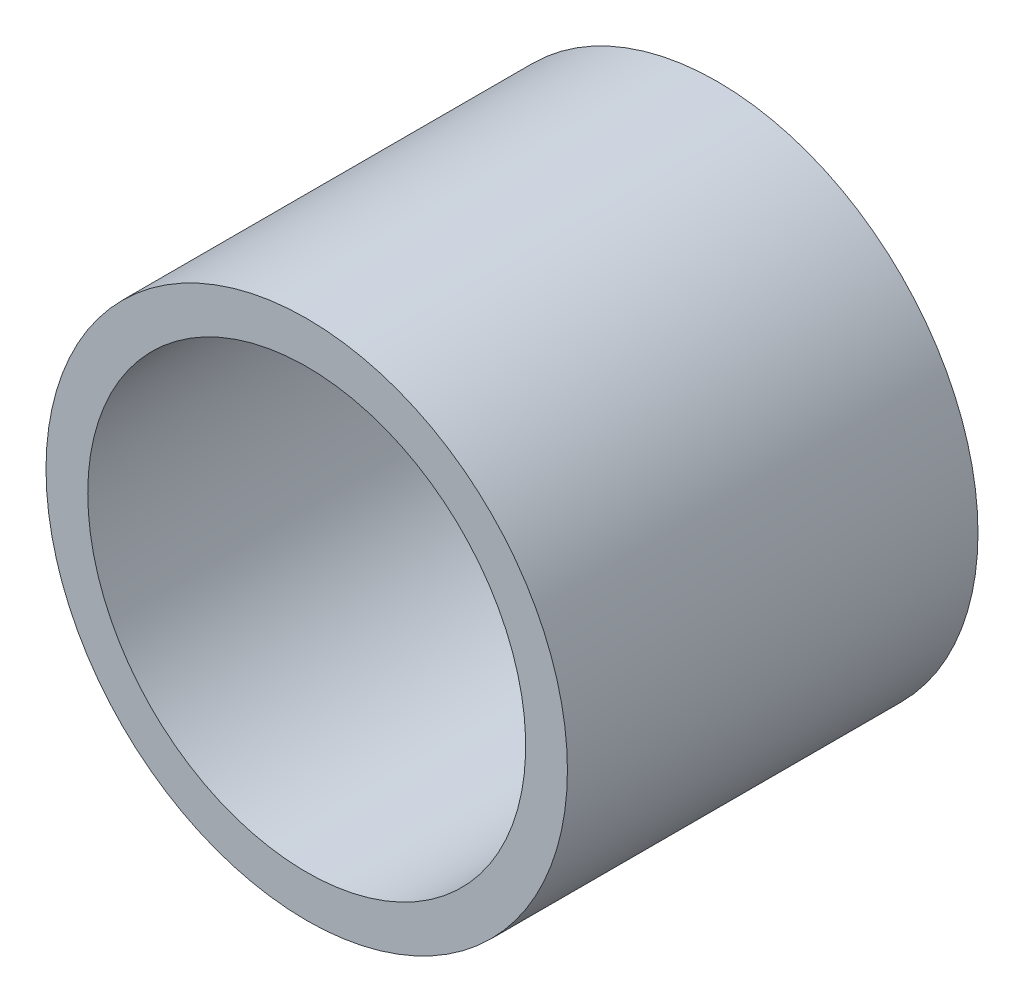
ISO-10303-21;
HEADER;
FILE_DESCRIPTION(('STEP AP214'),'2;1');
FILE_NAME('part.step','',(''),(''),'','','');
FILE_SCHEMA(('AUTOMOTIVE_DESIGN { 1 0 10303 214 1 1 1 1 }'));
ENDSEC;
DATA;
#1=APPLICATION_CONTEXT('core data for automotive mechanical design processes');
#2=APPLICATION_PROTOCOL_DEFINITION('international standard','automotive_design',2000,#1);
#3=PRODUCT_CONTEXT('',#1,'mechanical');
#4=PRODUCT('Part','Part','',(#3));
#5=PRODUCT_RELATED_PRODUCT_CATEGORY('part','',(#4));
#6=PRODUCT_DEFINITION_FORMATION('','',#4);
#7=PRODUCT_DEFINITION_CONTEXT('part definition',#1,'design');
#8=PRODUCT_DEFINITION('design','',#6,#7);
#9=PRODUCT_DEFINITION_SHAPE('','',#8);
#10=(LENGTH_UNIT() NAMED_UNIT(*) SI_UNIT(.MILLI.,.METRE.));
#11=(NAMED_UNIT(*) PLANE_ANGLE_UNIT() SI_UNIT($,.RADIAN.));
#12=(NAMED_UNIT(*) SI_UNIT($,.STERADIAN.) SOLID_ANGLE_UNIT());
#13=UNCERTAINTY_MEASURE_WITH_UNIT(LENGTH_MEASURE(1.E-05),#10,'distance_accuracy_value','');
#14=(GEOMETRIC_REPRESENTATION_CONTEXT(3) GLOBAL_UNCERTAINTY_ASSIGNED_CONTEXT((#13)) GLOBAL_UNIT_ASSIGNED_CONTEXT((#10,
#11,#12)) REPRESENTATION_CONTEXT('',''));
#15=CARTESIAN_POINT('',(0.,0.,0.));
#16=DIRECTION('',(0.,0.,1.));
#17=DIRECTION('',(1.,0.,0.));
#18=AXIS2_PLACEMENT_3D('',#15,#16,#17);
#19=CARTESIAN_POINT('',(0.,0.,38.1));
#20=DIRECTION('',(0.,0.,1.));
#21=DIRECTION('',(1.,0.,0.));
#22=AXIS2_PLACEMENT_3D('',#19,#20,#21);
#23=PLANE('',#22);
#24=CARTESIAN_POINT('',(0.,0.,38.1));
#25=DIRECTION('',(0.,0.,1.));
#26=DIRECTION('',(1.,0.,0.));
#27=AXIS2_PLACEMENT_3D('',#24,#25,#26);
#28=CIRCLE('',#27,24.1935);
#29=CARTESIAN_POINT('',(-24.1935,0.,38.1));
#30=VERTEX_POINT('',#29);
#31=EDGE_CURVE('E10',#30,#30,#28,.T.);
#32=ORIENTED_EDGE('',*,*,#31,.T.);
#33=EDGE_LOOP('',(#32));
#34=FACE_BOUND('',#33,.T.);
#35=CARTESIAN_POINT('',(0.,0.,38.1));
#36=DIRECTION('',(0.,0.,1.));
#37=DIRECTION('',(1.,0.,0.));
#38=AXIS2_PLACEMENT_3D('',#35,#36,#37);
#39=CIRCLE('',#38,20.32);
#40=CARTESIAN_POINT('',(-20.32,0.,38.1));
#41=VERTEX_POINT('',#40);
#42=EDGE_CURVE('E42',#41,#41,#39,.T.);
#43=ORIENTED_EDGE('',*,*,#42,.F.);
#44=EDGE_LOOP('',(#43));
#45=FACE_BOUND('',#44,.T.);
#46=ADVANCED_FACE('F31',(#34,#45),#23,.T.);
#47=CARTESIAN_POINT('',(0.,0.,0.));
#48=DIRECTION('',(0.,0.,1.));
#49=DIRECTION('',(1.,0.,0.));
#50=AXIS2_PLACEMENT_3D('',#47,#48,#49);
#51=PLANE('',#50);
#52=CARTESIAN_POINT('',(0.,0.,0.));
#53=DIRECTION('',(0.,0.,1.));
#54=DIRECTION('',(1.,0.,0.));
#55=AXIS2_PLACEMENT_3D('',#52,#53,#54);
#56=CIRCLE('',#55,24.1935);
#57=CARTESIAN_POINT('',(-24.1935,0.,0.));
#58=VERTEX_POINT('',#57);
#59=EDGE_CURVE('E35',#58,#58,#56,.T.);
#60=ORIENTED_EDGE('',*,*,#59,.F.);
#61=EDGE_LOOP('',(#60));
#62=FACE_BOUND('',#61,.T.);
#63=CARTESIAN_POINT('',(0.,0.,0.));
#64=DIRECTION('',(0.,0.,1.));
#65=DIRECTION('',(1.,0.,0.));
#66=AXIS2_PLACEMENT_3D('',#63,#64,#65);
#67=CIRCLE('',#66,20.32);
#68=CARTESIAN_POINT('',(-20.32,0.,0.));
#69=VERTEX_POINT('',#68);
#70=EDGE_CURVE('E44',#69,#69,#67,.T.);
#71=ORIENTED_EDGE('',*,*,#70,.T.);
#72=EDGE_LOOP('',(#71));
#73=FACE_BOUND('',#72,.T.);
#74=ADVANCED_FACE('F54',(#62,#73),#51,.F.);
#75=CARTESIAN_POINT('',(0.,0.,38.1));
#76=DIRECTION('',(0.,0.,-1.));
#77=DIRECTION('',(-1.,0.,0.));
#78=AXIS2_PLACEMENT_3D('',#75,#76,#77);
#79=CYLINDRICAL_SURFACE('',#78,24.1935);
#80=CARTESIAN_POINT('',(-24.1935,0.,38.1));
#81=CARTESIAN_POINT('',(-24.1935,0.,37.703125));
#82=CARTESIAN_POINT('',(-24.1935,0.,37.30625));
#83=CARTESIAN_POINT('',(-24.1935,0.,36.5125));
#84=CARTESIAN_POINT('',(-24.1935,0.,36.115625));
#85=CARTESIAN_POINT('',(-24.1935,0.,35.321875));
#86=CARTESIAN_POINT('',(-24.1935,0.,34.925));
#87=CARTESIAN_POINT('',(-24.1935,0.,34.13125));
#88=CARTESIAN_POINT('',(-24.1935,0.,33.734375));
#89=CARTESIAN_POINT('',(-24.1935,0.,32.940625));
#90=CARTESIAN_POINT('',(-24.1935,0.,32.54375));
#91=CARTESIAN_POINT('',(-24.1935,0.,31.75));
#92=CARTESIAN_POINT('',(-24.1935,0.,31.353125));
#93=CARTESIAN_POINT('',(-24.1935,0.,30.559375));
#94=CARTESIAN_POINT('',(-24.1935,0.,30.1625));
#95=CARTESIAN_POINT('',(-24.1935,0.,29.36875));
#96=CARTESIAN_POINT('',(-24.1935,0.,28.971875));
#97=CARTESIAN_POINT('',(-24.1935,0.,28.178125));
#98=CARTESIAN_POINT('',(-24.1935,0.,27.78125));
#99=CARTESIAN_POINT('',(-24.1935,0.,26.9875));
#100=CARTESIAN_POINT('',(-24.1935,0.,26.590625));
#101=CARTESIAN_POINT('',(-24.1935,0.,25.796875));
#102=CARTESIAN_POINT('',(-24.1935,0.,25.4));
#103=CARTESIAN_POINT('',(-24.1935,0.,24.60625));
#104=CARTESIAN_POINT('',(-24.1935,0.,24.209375));
#105=CARTESIAN_POINT('',(-24.1935,0.,23.415625));
#106=CARTESIAN_POINT('',(-24.1935,0.,23.01875));
#107=CARTESIAN_POINT('',(-24.1935,0.,22.225));
#108=CARTESIAN_POINT('',(-24.1935,0.,21.828125));
#109=CARTESIAN_POINT('',(-24.1935,0.,21.034375));
#110=CARTESIAN_POINT('',(-24.1935,0.,20.6375));
#111=CARTESIAN_POINT('',(-24.1935,0.,19.84375));
#112=CARTESIAN_POINT('',(-24.1935,0.,19.446875));
#113=CARTESIAN_POINT('',(-24.1935,0.,18.653125));
#114=CARTESIAN_POINT('',(-24.1935,0.,18.25625));
#115=CARTESIAN_POINT('',(-24.1935,0.,17.4625));
#116=CARTESIAN_POINT('',(-24.1935,0.,17.065625));
#117=CARTESIAN_POINT('',(-24.1935,0.,16.271875));
#118=CARTESIAN_POINT('',(-24.1935,0.,15.875));
#119=CARTESIAN_POINT('',(-24.1935,0.,15.08125));
#120=CARTESIAN_POINT('',(-24.1935,0.,14.684375));
#121=CARTESIAN_POINT('',(-24.1935,0.,13.890625));
#122=CARTESIAN_POINT('',(-24.1935,0.,13.49375));
#123=CARTESIAN_POINT('',(-24.1935,0.,12.7));
#124=CARTESIAN_POINT('',(-24.1935,0.,12.303125));
#125=CARTESIAN_POINT('',(-24.1935,0.,11.509375));
#126=CARTESIAN_POINT('',(-24.1935,0.,11.1125));
#127=CARTESIAN_POINT('',(-24.1935,0.,10.31875));
#128=CARTESIAN_POINT('',(-24.1935,0.,9.92187499999999));
#129=CARTESIAN_POINT('',(-24.1935,0.,9.128125));
#130=CARTESIAN_POINT('',(-24.1935,0.,8.73124999999999));
#131=CARTESIAN_POINT('',(-24.1935,0.,7.93749999999999));
#132=CARTESIAN_POINT('',(-24.1935,0.,7.54062499999999));
#133=CARTESIAN_POINT('',(-24.1935,0.,6.746875));
#134=CARTESIAN_POINT('',(-24.1935,0.,6.35));
#135=CARTESIAN_POINT('',(-24.1935,0.,5.55625));
#136=CARTESIAN_POINT('',(-24.1935,0.,5.159375));
#137=CARTESIAN_POINT('',(-24.1935,0.,4.365625));
#138=CARTESIAN_POINT('',(-24.1935,0.,3.96875));
#139=CARTESIAN_POINT('',(-24.1935,0.,3.175));
#140=CARTESIAN_POINT('',(-24.1935,0.,2.778125));
#141=CARTESIAN_POINT('',(-24.1935,0.,1.984375));
#142=CARTESIAN_POINT('',(-24.1935,0.,1.5875));
#143=CARTESIAN_POINT('',(-24.1935,0.,0.79375));
#144=CARTESIAN_POINT('',(-24.1935,0.,0.396875));
#145=CARTESIAN_POINT('',(-24.1935,0.,0.));
#146=B_SPLINE_CURVE_WITH_KNOTS('',3,(#80,#81,#82,#83,#84,#85,#86,#87,#88,#89,#90,#91,#92,#93,
#94,#95,#96,#97,#98,#99,#100,#101,#102,#103,#104,#105,#106,#107,#108,#109,#110,#111,#112,#113,
#114,#115,#116,#117,#118,#119,#120,#121,#122,#123,#124,#125,#126,#127,#128,#129,#130,#131,#132,
#133,#134,#135,#136,#137,#138,#139,#140,#141,#142,#143,#144,#145),.UNSPECIFIED.,.F.,.F.,(4,2,2,
2,2,2,2,2,2,2,2,2,2,2,2,2,2,2,2,2,2,2,2,2,2,2,2,2,2,2,2,2,4),(0.,1.190625,2.38125,3.571875,
4.7625,5.953125,7.14375,8.334375,9.52500000000001,10.715625,11.90625,13.096875,14.2875,
15.478125,16.66875,17.859375,19.05,20.240625,21.43125,22.621875,23.8125,25.003125,26.19375,
27.384375,28.575,29.765625,30.95625,32.146875,33.3375,34.528125,35.71875,36.909375,38.1),.UNSPECIFIED.);
#147=EDGE_CURVE('BSEAM33',#30,#58,#146,.T.);
#148=ORIENTED_EDGE('',*,*,#31,.F.);
#149=ORIENTED_EDGE('',*,*,#59,.T.);
#150=ORIENTED_EDGE('',*,*,#147,.T.);
#151=ORIENTED_EDGE('',*,*,#147,.F.);
#152=EDGE_LOOP('',(#148,#150,#149,#151));
#153=FACE_BOUND('',#152,.T.);
#154=ADVANCED_FACE('F33',(#153),#79,.T.);
#155=CARTESIAN_POINT('',(0.,0.,38.1));
#156=DIRECTION('',(0.,0.,-1.));
#157=DIRECTION('',(-1.,0.,0.));
#158=AXIS2_PLACEMENT_3D('',#155,#156,#157);
#159=CYLINDRICAL_SURFACE('',#158,20.32);
#160=CARTESIAN_POINT('',(-20.32,0.,38.1));
#161=CARTESIAN_POINT('',(-20.32,0.,37.703125));
#162=CARTESIAN_POINT('',(-20.32,0.,37.30625));
#163=CARTESIAN_POINT('',(-20.32,0.,36.5125));
#164=CARTESIAN_POINT('',(-20.32,0.,36.115625));
#165=CARTESIAN_POINT('',(-20.32,0.,35.321875));
#166=CARTESIAN_POINT('',(-20.32,0.,34.925));
#167=CARTESIAN_POINT('',(-20.32,0.,34.13125));
#168=CARTESIAN_POINT('',(-20.32,0.,33.734375));
#169=CARTESIAN_POINT('',(-20.32,0.,32.940625));
#170=CARTESIAN_POINT('',(-20.32,0.,32.54375));
#171=CARTESIAN_POINT('',(-20.32,0.,31.75));
#172=CARTESIAN_POINT('',(-20.32,0.,31.353125));
#173=CARTESIAN_POINT('',(-20.32,0.,30.559375));
#174=CARTESIAN_POINT('',(-20.32,0.,30.1625));
#175=CARTESIAN_POINT('',(-20.32,0.,29.36875));
#176=CARTESIAN_POINT('',(-20.32,0.,28.971875));
#177=CARTESIAN_POINT('',(-20.32,0.,28.178125));
#178=CARTESIAN_POINT('',(-20.32,0.,27.78125));
#179=CARTESIAN_POINT('',(-20.32,0.,26.9875));
#180=CARTESIAN_POINT('',(-20.32,0.,26.590625));
#181=CARTESIAN_POINT('',(-20.32,0.,25.796875));
#182=CARTESIAN_POINT('',(-20.32,0.,25.4));
#183=CARTESIAN_POINT('',(-20.32,0.,24.60625));
#184=CARTESIAN_POINT('',(-20.32,0.,24.209375));
#185=CARTESIAN_POINT('',(-20.32,0.,23.415625));
#186=CARTESIAN_POINT('',(-20.32,0.,23.01875));
#187=CARTESIAN_POINT('',(-20.32,0.,22.225));
#188=CARTESIAN_POINT('',(-20.32,0.,21.828125));
#189=CARTESIAN_POINT('',(-20.32,0.,21.034375));
#190=CARTESIAN_POINT('',(-20.32,0.,20.6375));
#191=CARTESIAN_POINT('',(-20.32,0.,19.84375));
#192=CARTESIAN_POINT('',(-20.32,0.,19.446875));
#193=CARTESIAN_POINT('',(-20.32,0.,18.653125));
#194=CARTESIAN_POINT('',(-20.32,0.,18.25625));
#195=CARTESIAN_POINT('',(-20.32,0.,17.4625));
#196=CARTESIAN_POINT('',(-20.32,0.,17.065625));
#197=CARTESIAN_POINT('',(-20.32,0.,16.271875));
#198=CARTESIAN_POINT('',(-20.32,0.,15.875));
#199=CARTESIAN_POINT('',(-20.32,0.,15.08125));
#200=CARTESIAN_POINT('',(-20.32,0.,14.684375));
#201=CARTESIAN_POINT('',(-20.32,0.,13.890625));
#202=CARTESIAN_POINT('',(-20.32,0.,13.49375));
#203=CARTESIAN_POINT('',(-20.32,0.,12.7));
#204=CARTESIAN_POINT('',(-20.32,0.,12.303125));
#205=CARTESIAN_POINT('',(-20.32,0.,11.509375));
#206=CARTESIAN_POINT('',(-20.32,0.,11.1125));
#207=CARTESIAN_POINT('',(-20.32,0.,10.31875));
#208=CARTESIAN_POINT('',(-20.32,0.,9.92187499999999));
#209=CARTESIAN_POINT('',(-20.32,0.,9.128125));
#210=CARTESIAN_POINT('',(-20.32,0.,8.73124999999999));
#211=CARTESIAN_POINT('',(-20.32,0.,7.93749999999999));
#212=CARTESIAN_POINT('',(-20.32,0.,7.54062499999999));
#213=CARTESIAN_POINT('',(-20.32,0.,6.746875));
#214=CARTESIAN_POINT('',(-20.32,0.,6.35));
#215=CARTESIAN_POINT('',(-20.32,0.,5.55625));
#216=CARTESIAN_POINT('',(-20.32,0.,5.159375));
#217=CARTESIAN_POINT('',(-20.32,0.,4.365625));
#218=CARTESIAN_POINT('',(-20.32,0.,3.96875));
#219=CARTESIAN_POINT('',(-20.32,0.,3.175));
#220=CARTESIAN_POINT('',(-20.32,0.,2.778125));
#221=CARTESIAN_POINT('',(-20.32,0.,1.984375));
#222=CARTESIAN_POINT('',(-20.32,0.,1.5875));
#223=CARTESIAN_POINT('',(-20.32,0.,0.79375));
#224=CARTESIAN_POINT('',(-20.32,0.,0.396875));
#225=CARTESIAN_POINT('',(-20.32,0.,0.));
#226=B_SPLINE_CURVE_WITH_KNOTS('',3,(#160,#161,#162,#163,#164,#165,#166,#167,#168,#169,#170,
#171,#172,#173,#174,#175,#176,#177,#178,#179,#180,#181,#182,#183,#184,#185,#186,#187,#188,#189,
#190,#191,#192,#193,#194,#195,#196,#197,#198,#199,#200,#201,#202,#203,#204,#205,#206,#207,#208,
#209,#210,#211,#212,#213,#214,#215,#216,#217,#218,#219,#220,#221,#222,#223,#224,#225),
.UNSPECIFIED.,.F.,.F.,(4,2,2,2,2,2,2,2,2,2,2,2,2,2,2,2,2,2,2,2,2,2,2,2,2,2,2,2,2,2,2,2,4),(0.,
1.190625,2.38125,3.571875,4.7625,5.953125,7.14375,8.334375,9.52500000000001,10.715625,11.90625,
13.096875,14.2875,15.478125,16.66875,17.859375,19.05,20.240625,21.43125,22.621875,23.8125,
25.003125,26.19375,27.384375,28.575,29.765625,30.95625,32.146875,33.3375,34.528125,35.71875,
36.909375,38.1),.UNSPECIFIED.);
#227=EDGE_CURVE('BSEAM50',#41,#69,#226,.T.);
#228=ORIENTED_EDGE('',*,*,#42,.T.);
#229=ORIENTED_EDGE('',*,*,#70,.F.);
#230=ORIENTED_EDGE('',*,*,#227,.T.);
#231=ORIENTED_EDGE('',*,*,#227,.F.);
#232=EDGE_LOOP('',(#228,#230,#229,#231));
#233=FACE_BOUND('',#232,.T.);
#234=ADVANCED_FACE('F50',(#233),#159,.F.);
#235=CLOSED_SHELL('',(#46,#74,#154,#234));
#236=MANIFOLD_SOLID_BREP('B2',#235);
#237=ADVANCED_BREP_SHAPE_REPRESENTATION('',(#18,#236),#14);
#238=SHAPE_DEFINITION_REPRESENTATION(#9,#237);
ENDSEC;
END-ISO-10303-21;
